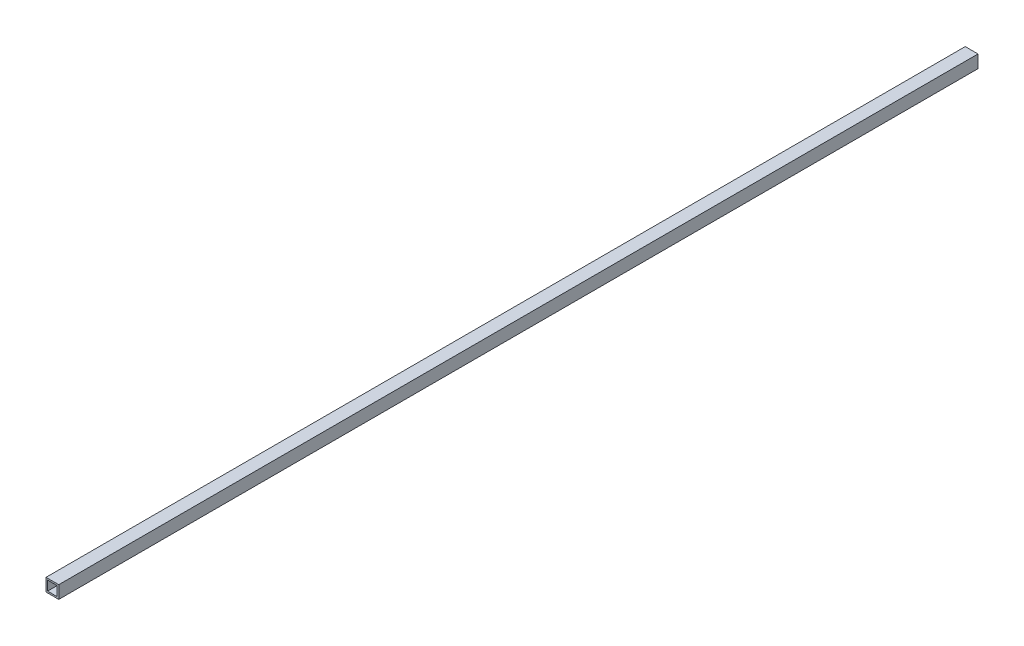
ISO-10303-21;
HEADER;
FILE_DESCRIPTION(('STEP AP214'),'2;1');
FILE_NAME('part.step','',(''),(''),'','','');
FILE_SCHEMA(('AUTOMOTIVE_DESIGN { 1 0 10303 214 1 1 1 1 }'));
ENDSEC;
DATA;
#1=APPLICATION_CONTEXT('core data for automotive mechanical design processes');
#2=APPLICATION_PROTOCOL_DEFINITION('international standard','automotive_design',2000,#1);
#3=PRODUCT_CONTEXT('',#1,'mechanical');
#4=PRODUCT('Part','Part','',(#3));
#5=PRODUCT_RELATED_PRODUCT_CATEGORY('part','',(#4));
#6=PRODUCT_DEFINITION_FORMATION('','',#4);
#7=PRODUCT_DEFINITION_CONTEXT('part definition',#1,'design');
#8=PRODUCT_DEFINITION('design','',#6,#7);
#9=PRODUCT_DEFINITION_SHAPE('','',#8);
#10=(LENGTH_UNIT() NAMED_UNIT(*) SI_UNIT(.MILLI.,.METRE.));
#11=(NAMED_UNIT(*) PLANE_ANGLE_UNIT() SI_UNIT($,.RADIAN.));
#12=(NAMED_UNIT(*) SI_UNIT($,.STERADIAN.) SOLID_ANGLE_UNIT());
#13=UNCERTAINTY_MEASURE_WITH_UNIT(LENGTH_MEASURE(1.E-05),#10,'distance_accuracy_value','');
#14=(GEOMETRIC_REPRESENTATION_CONTEXT(3) GLOBAL_UNCERTAINTY_ASSIGNED_CONTEXT((#13)) GLOBAL_UNIT_ASSIGNED_CONTEXT((#10,
#11,#12)) REPRESENTATION_CONTEXT('',''));
#15=CARTESIAN_POINT('',(0.,0.,0.));
#16=DIRECTION('',(0.,0.,1.));
#17=DIRECTION('',(1.,0.,0.));
#18=AXIS2_PLACEMENT_3D('',#15,#16,#17);
#19=CARTESIAN_POINT('',(0.,0.,457.2));
#20=DIRECTION('',(0.,0.,1.));
#21=DIRECTION('',(1.,0.,0.));
#22=AXIS2_PLACEMENT_3D('',#19,#20,#21);
#23=PLANE('',#22);
#24=DIRECTION('',(0.,-1.,0.));
#25=VECTOR('',#24,1.);
#26=CARTESIAN_POINT('',(-6.35,6.35,457.2));
#27=LINE('',#26,#25);
#28=CARTESIAN_POINT('',(-6.35,6.35,457.2));
#29=VERTEX_POINT('',#28);
#30=CARTESIAN_POINT('',(-6.35,-6.35,457.2));
#31=VERTEX_POINT('',#30);
#32=EDGE_CURVE('E119',#29,#31,#27,.T.);
#33=ORIENTED_EDGE('',*,*,#32,.T.);
#34=DIRECTION('',(1.,0.,0.));
#35=VECTOR('',#34,1.);
#36=CARTESIAN_POINT('',(-6.35,-6.35,457.2));
#37=LINE('',#36,#35);
#38=CARTESIAN_POINT('',(6.35,-6.35,457.2));
#39=VERTEX_POINT('',#38);
#40=EDGE_CURVE('E178',#31,#39,#37,.T.);
#41=ORIENTED_EDGE('',*,*,#40,.T.);
#42=DIRECTION('',(0.,1.,0.));
#43=VECTOR('',#42,1.);
#44=CARTESIAN_POINT('',(6.35,-6.35,457.2));
#45=LINE('',#44,#43);
#46=CARTESIAN_POINT('',(6.35,6.35,457.2));
#47=VERTEX_POINT('',#46);
#48=EDGE_CURVE('E181',#39,#47,#45,.T.);
#49=ORIENTED_EDGE('',*,*,#48,.T.);
#50=DIRECTION('',(-1.,0.,0.));
#51=VECTOR('',#50,1.);
#52=CARTESIAN_POINT('',(6.35,6.35,457.2));
#53=LINE('',#52,#51);
#54=EDGE_CURVE('E65',#47,#29,#53,.T.);
#55=ORIENTED_EDGE('',*,*,#54,.T.);
#56=EDGE_LOOP('',(#33,#41,#49,#55));
#57=FACE_BOUND('',#56,.T.);
#58=DIRECTION('',(1.,0.,0.));
#59=VECTOR('',#58,1.);
#60=CARTESIAN_POINT('',(-4.7625,-4.7625,457.2));
#61=LINE('',#60,#59);
#62=CARTESIAN_POINT('',(-4.7625,-4.7625,457.2));
#63=VERTEX_POINT('',#62);
#64=CARTESIAN_POINT('',(4.76250000000001,-4.7625,457.2));
#65=VERTEX_POINT('',#64);
#66=EDGE_CURVE('E160',#63,#65,#61,.T.);
#67=ORIENTED_EDGE('',*,*,#66,.F.);
#68=DIRECTION('',(0.,-1.,0.));
#69=VECTOR('',#68,1.);
#70=CARTESIAN_POINT('',(-4.7625,4.7625,457.2));
#71=LINE('',#70,#69);
#72=CARTESIAN_POINT('',(-4.7625,4.7625,457.2));
#73=VERTEX_POINT('',#72);
#74=EDGE_CURVE('E115',#73,#63,#71,.T.);
#75=ORIENTED_EDGE('',*,*,#74,.F.);
#76=DIRECTION('',(-1.,0.,0.));
#77=VECTOR('',#76,1.);
#78=CARTESIAN_POINT('',(4.76250000000001,4.7625,457.2));
#79=LINE('',#78,#77);
#80=CARTESIAN_POINT('',(4.76250000000001,4.7625,457.2));
#81=VERTEX_POINT('',#80);
#82=EDGE_CURVE('E166',#81,#73,#79,.T.);
#83=ORIENTED_EDGE('',*,*,#82,.F.);
#84=DIRECTION('',(0.,1.,0.));
#85=VECTOR('',#84,1.);
#86=CARTESIAN_POINT('',(4.76250000000001,-4.7625,457.2));
#87=LINE('',#86,#85);
#88=EDGE_CURVE('E163',#65,#81,#87,.T.);
#89=ORIENTED_EDGE('',*,*,#88,.F.);
#90=EDGE_LOOP('',(#67,#75,#83,#89));
#91=FACE_BOUND('',#90,.T.);
#92=ADVANCED_FACE('F41',(#57,#91),#23,.T.);
#93=CARTESIAN_POINT('',(-6.35,6.35,457.2));
#94=DIRECTION('',(1.,0.,0.));
#95=DIRECTION('',(0.,0.,-1.));
#96=AXIS2_PLACEMENT_3D('',#93,#94,#95);
#97=PLANE('',#96);
#98=DIRECTION('',(0.,0.,-1.));
#99=VECTOR('',#98,1.);
#100=CARTESIAN_POINT('',(-6.35,6.35,457.2));
#101=LINE('',#100,#99);
#102=CARTESIAN_POINT('',(-6.35,6.35,-457.2));
#103=VERTEX_POINT('',#102);
#104=EDGE_CURVE('E186',#29,#103,#101,.T.);
#105=ORIENTED_EDGE('',*,*,#104,.T.);
#106=DIRECTION('',(0.,-1.,0.));
#107=VECTOR('',#106,1.);
#108=CARTESIAN_POINT('',(-6.35,6.35,-457.2));
#109=LINE('',#108,#107);
#110=CARTESIAN_POINT('',(-6.35,-6.35,-457.2));
#111=VERTEX_POINT('',#110);
#112=EDGE_CURVE('E142',#103,#111,#109,.T.);
#113=ORIENTED_EDGE('',*,*,#112,.T.);
#114=DIRECTION('',(0.,0.,-1.));
#115=VECTOR('',#114,1.);
#116=CARTESIAN_POINT('',(-6.35,-6.35,457.2));
#117=LINE('',#116,#115);
#118=EDGE_CURVE('E11',#31,#111,#117,.T.);
#119=ORIENTED_EDGE('',*,*,#118,.F.);
#120=ORIENTED_EDGE('',*,*,#32,.F.);
#121=EDGE_LOOP('',(#105,#113,#119,#120));
#122=FACE_BOUND('',#121,.T.);
#123=ADVANCED_FACE('F43',(#122),#97,.F.);
#124=CARTESIAN_POINT('',(-6.35,-6.35,457.2));
#125=DIRECTION('',(0.,1.,0.));
#126=DIRECTION('',(-1.,0.,0.));
#127=AXIS2_PLACEMENT_3D('',#124,#125,#126);
#128=PLANE('',#127);
#129=ORIENTED_EDGE('',*,*,#118,.T.);
#130=DIRECTION('',(1.,0.,0.));
#131=VECTOR('',#130,1.);
#132=CARTESIAN_POINT('',(-6.35,-6.35,-457.2));
#133=LINE('',#132,#131);
#134=CARTESIAN_POINT('',(6.35,-6.35,-457.2));
#135=VERTEX_POINT('',#134);
#136=EDGE_CURVE('E146',#111,#135,#133,.T.);
#137=ORIENTED_EDGE('',*,*,#136,.T.);
#138=DIRECTION('',(0.,0.,-1.));
#139=VECTOR('',#138,1.);
#140=CARTESIAN_POINT('',(6.35,-6.35,457.2));
#141=LINE('',#140,#139);
#142=EDGE_CURVE('E50',#39,#135,#141,.T.);
#143=ORIENTED_EDGE('',*,*,#142,.F.);
#144=ORIENTED_EDGE('',*,*,#40,.F.);
#145=EDGE_LOOP('',(#129,#137,#143,#144));
#146=FACE_BOUND('',#145,.T.);
#147=ADVANCED_FACE('F202',(#146),#128,.F.);
#148=CARTESIAN_POINT('',(6.35,-6.35,457.2));
#149=DIRECTION('',(-1.,0.,0.));
#150=DIRECTION('',(0.,0.,1.));
#151=AXIS2_PLACEMENT_3D('',#148,#149,#150);
#152=PLANE('',#151);
#153=ORIENTED_EDGE('',*,*,#142,.T.);
#154=DIRECTION('',(0.,1.,0.));
#155=VECTOR('',#154,1.);
#156=CARTESIAN_POINT('',(6.35,-6.35,-457.2));
#157=LINE('',#156,#155);
#158=CARTESIAN_POINT('',(6.35,6.35,-457.2));
#159=VERTEX_POINT('',#158);
#160=EDGE_CURVE('E150',#135,#159,#157,.T.);
#161=ORIENTED_EDGE('',*,*,#160,.T.);
#162=DIRECTION('',(0.,0.,-1.));
#163=VECTOR('',#162,1.);
#164=CARTESIAN_POINT('',(6.35,6.35,457.2));
#165=LINE('',#164,#163);
#166=EDGE_CURVE('E189',#47,#159,#165,.T.);
#167=ORIENTED_EDGE('',*,*,#166,.F.);
#168=ORIENTED_EDGE('',*,*,#48,.F.);
#169=EDGE_LOOP('',(#153,#161,#167,#168));
#170=FACE_BOUND('',#169,.T.);
#171=ADVANCED_FACE('F196',(#170),#152,.F.);
#172=CARTESIAN_POINT('',(6.35,6.35,457.2));
#173=DIRECTION('',(0.,-1.,0.));
#174=DIRECTION('',(1.,0.,0.));
#175=AXIS2_PLACEMENT_3D('',#172,#173,#174);
#176=PLANE('',#175);
#177=ORIENTED_EDGE('',*,*,#166,.T.);
#178=DIRECTION('',(-1.,0.,0.));
#179=VECTOR('',#178,1.);
#180=CARTESIAN_POINT('',(6.35,6.35,-457.2));
#181=LINE('',#180,#179);
#182=EDGE_CURVE('E154',#159,#103,#181,.T.);
#183=ORIENTED_EDGE('',*,*,#182,.T.);
#184=ORIENTED_EDGE('',*,*,#104,.F.);
#185=ORIENTED_EDGE('',*,*,#54,.F.);
#186=EDGE_LOOP('',(#177,#183,#184,#185));
#187=FACE_BOUND('',#186,.T.);
#188=ADVANCED_FACE('F207',(#187),#176,.F.);
#189=CARTESIAN_POINT('',(-4.7625,4.7625,457.2));
#190=DIRECTION('',(1.,0.,0.));
#191=DIRECTION('',(0.,1.,0.));
#192=AXIS2_PLACEMENT_3D('',#189,#190,#191);
#193=PLANE('',#192);
#194=DIRECTION('',(0.,0.,-1.));
#195=VECTOR('',#194,1.);
#196=CARTESIAN_POINT('',(-4.7625,-4.7625,457.2));
#197=LINE('',#196,#195);
#198=CARTESIAN_POINT('',(-4.7625,-4.7625,-457.2));
#199=VERTEX_POINT('',#198);
#200=EDGE_CURVE('E107',#63,#199,#197,.T.);
#201=ORIENTED_EDGE('',*,*,#200,.T.);
#202=DIRECTION('',(0.,-1.,0.));
#203=VECTOR('',#202,1.);
#204=CARTESIAN_POINT('',(-4.7625,4.7625,-457.2));
#205=LINE('',#204,#203);
#206=CARTESIAN_POINT('',(-4.7625,4.7625,-457.2));
#207=VERTEX_POINT('',#206);
#208=EDGE_CURVE('E112',#207,#199,#205,.T.);
#209=ORIENTED_EDGE('',*,*,#208,.F.);
#210=DIRECTION('',(0.,0.,-1.));
#211=VECTOR('',#210,1.);
#212=CARTESIAN_POINT('',(-4.7625,4.7625,457.2));
#213=LINE('',#212,#211);
#214=EDGE_CURVE('E169',#73,#207,#213,.T.);
#215=ORIENTED_EDGE('',*,*,#214,.F.);
#216=ORIENTED_EDGE('',*,*,#74,.T.);
#217=EDGE_LOOP('',(#201,#209,#215,#216));
#218=FACE_BOUND('',#217,.T.);
#219=ADVANCED_FACE('F109',(#218),#193,.T.);
#220=CARTESIAN_POINT('',(-4.7625,-4.7625,457.2));
#221=DIRECTION('',(0.,1.,0.));
#222=DIRECTION('',(0.,0.,1.));
#223=AXIS2_PLACEMENT_3D('',#220,#221,#222);
#224=PLANE('',#223);
#225=DIRECTION('',(0.,0.,-1.));
#226=VECTOR('',#225,1.);
#227=CARTESIAN_POINT('',(4.76250000000001,-4.7625,457.2));
#228=LINE('',#227,#226);
#229=CARTESIAN_POINT('',(4.76250000000001,-4.7625,-457.2));
#230=VERTEX_POINT('',#229);
#231=EDGE_CURVE('E120',#65,#230,#228,.T.);
#232=ORIENTED_EDGE('',*,*,#231,.T.);
#233=DIRECTION('',(1.,0.,0.));
#234=VECTOR('',#233,1.);
#235=CARTESIAN_POINT('',(-4.7625,-4.7625,-457.2));
#236=LINE('',#235,#234);
#237=EDGE_CURVE('E123',#199,#230,#236,.T.);
#238=ORIENTED_EDGE('',*,*,#237,.F.);
#239=ORIENTED_EDGE('',*,*,#200,.F.);
#240=ORIENTED_EDGE('',*,*,#66,.T.);
#241=EDGE_LOOP('',(#232,#238,#239,#240));
#242=FACE_BOUND('',#241,.T.);
#243=ADVANCED_FACE('F124',(#242),#224,.T.);
#244=CARTESIAN_POINT('',(4.76250000000001,-4.7625,457.2));
#245=DIRECTION('',(-1.,0.,0.));
#246=DIRECTION('',(0.,-1.,0.));
#247=AXIS2_PLACEMENT_3D('',#244,#245,#246);
#248=PLANE('',#247);
#249=DIRECTION('',(0.,0.,-1.));
#250=VECTOR('',#249,1.);
#251=CARTESIAN_POINT('',(4.76250000000001,4.7625,457.2));
#252=LINE('',#251,#250);
#253=CARTESIAN_POINT('',(4.76250000000001,4.7625,-457.2));
#254=VERTEX_POINT('',#253);
#255=EDGE_CURVE('E57',#81,#254,#252,.T.);
#256=ORIENTED_EDGE('',*,*,#255,.T.);
#257=DIRECTION('',(0.,1.,0.));
#258=VECTOR('',#257,1.);
#259=CARTESIAN_POINT('',(4.76250000000001,-4.7625,-457.2));
#260=LINE('',#259,#258);
#261=EDGE_CURVE('E130',#230,#254,#260,.T.);
#262=ORIENTED_EDGE('',*,*,#261,.F.);
#263=ORIENTED_EDGE('',*,*,#231,.F.);
#264=ORIENTED_EDGE('',*,*,#88,.T.);
#265=EDGE_LOOP('',(#256,#262,#263,#264));
#266=FACE_BOUND('',#265,.T.);
#267=ADVANCED_FACE('F225',(#266),#248,.T.);
#268=CARTESIAN_POINT('',(4.76250000000001,4.7625,457.2));
#269=DIRECTION('',(0.,-1.,0.));
#270=DIRECTION('',(0.,0.,-1.));
#271=AXIS2_PLACEMENT_3D('',#268,#269,#270);
#272=PLANE('',#271);
#273=ORIENTED_EDGE('',*,*,#214,.T.);
#274=DIRECTION('',(-1.,0.,0.));
#275=VECTOR('',#274,1.);
#276=CARTESIAN_POINT('',(4.76250000000001,4.7625,-457.2));
#277=LINE('',#276,#275);
#278=EDGE_CURVE('E134',#254,#207,#277,.T.);
#279=ORIENTED_EDGE('',*,*,#278,.F.);
#280=ORIENTED_EDGE('',*,*,#255,.F.);
#281=ORIENTED_EDGE('',*,*,#82,.T.);
#282=EDGE_LOOP('',(#273,#279,#280,#281));
#283=FACE_BOUND('',#282,.T.);
#284=ADVANCED_FACE('F228',(#283),#272,.T.);
#285=CARTESIAN_POINT('',(0.,0.,-457.2));
#286=DIRECTION('',(0.,0.,1.));
#287=DIRECTION('',(1.,0.,0.));
#288=AXIS2_PLACEMENT_3D('',#285,#286,#287);
#289=PLANE('',#288);
#290=ORIENTED_EDGE('',*,*,#278,.T.);
#291=ORIENTED_EDGE('',*,*,#208,.T.);
#292=ORIENTED_EDGE('',*,*,#237,.T.);
#293=ORIENTED_EDGE('',*,*,#261,.T.);
#294=EDGE_LOOP('',(#290,#291,#292,#293));
#295=FACE_BOUND('',#294,.T.);
#296=ORIENTED_EDGE('',*,*,#112,.F.);
#297=ORIENTED_EDGE('',*,*,#182,.F.);
#298=ORIENTED_EDGE('',*,*,#160,.F.);
#299=ORIENTED_EDGE('',*,*,#136,.F.);
#300=EDGE_LOOP('',(#296,#297,#298,#299));
#301=FACE_BOUND('',#300,.T.);
#302=ADVANCED_FACE('F132',(#295,#301),#289,.F.);
#303=CLOSED_SHELL('',(#92,#123,#147,#171,#188,#219,#243,#267,#284,#302));
#304=MANIFOLD_SOLID_BREP('B2',#303);
#305=ADVANCED_BREP_SHAPE_REPRESENTATION('',(#18,#304),#14);
#306=SHAPE_DEFINITION_REPRESENTATION(#9,#305);
ENDSEC;
END-ISO-10303-21;
